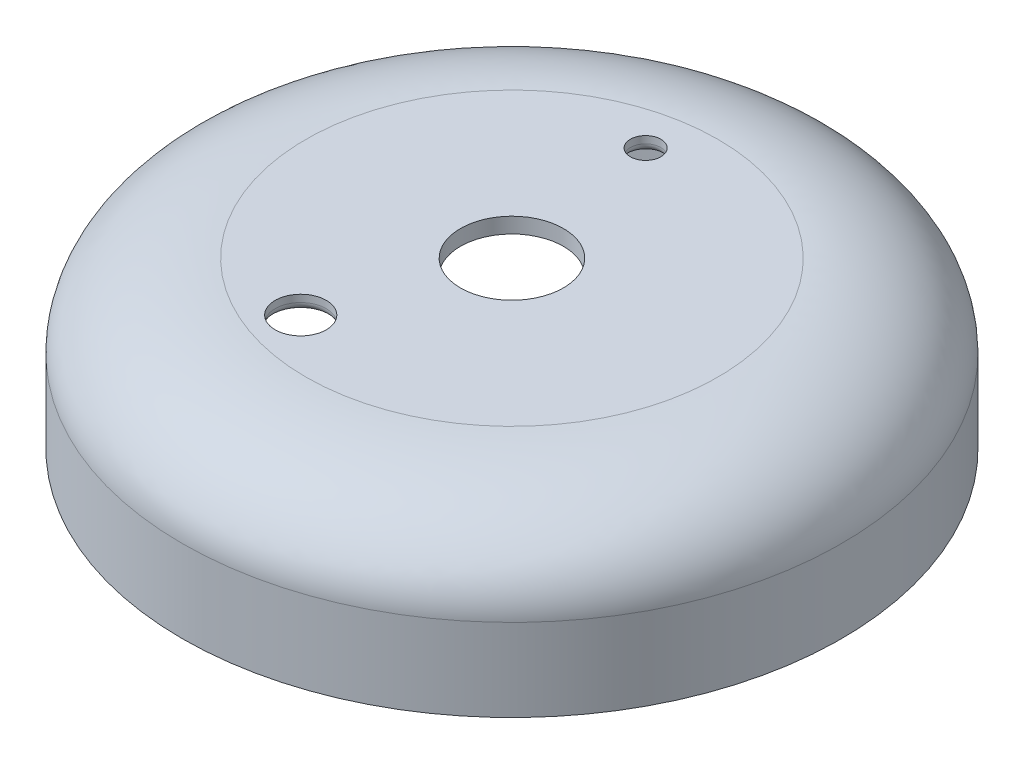
ISO-10303-21;
HEADER;
FILE_DESCRIPTION(('STEP AP214'),'2;1');
FILE_NAME('part.step','',(''),(''),'','','');
FILE_SCHEMA(('AUTOMOTIVE_DESIGN { 1 0 10303 214 1 1 1 1 }'));
ENDSEC;
DATA;
#1=APPLICATION_CONTEXT('core data for automotive mechanical design processes');
#2=APPLICATION_PROTOCOL_DEFINITION('international standard','automotive_design',2000,#1);
#3=PRODUCT_CONTEXT('',#1,'mechanical');
#4=PRODUCT('Part','Part','',(#3));
#5=PRODUCT_RELATED_PRODUCT_CATEGORY('part','',(#4));
#6=PRODUCT_DEFINITION_FORMATION('','',#4);
#7=PRODUCT_DEFINITION_CONTEXT('part definition',#1,'design');
#8=PRODUCT_DEFINITION('design','',#6,#7);
#9=PRODUCT_DEFINITION_SHAPE('','',#8);
#10=(LENGTH_UNIT() NAMED_UNIT(*) SI_UNIT(.MILLI.,.METRE.));
#11=(NAMED_UNIT(*) PLANE_ANGLE_UNIT() SI_UNIT($,.RADIAN.));
#12=(NAMED_UNIT(*) SI_UNIT($,.STERADIAN.) SOLID_ANGLE_UNIT());
#13=UNCERTAINTY_MEASURE_WITH_UNIT(LENGTH_MEASURE(1.E-05),#10,'distance_accuracy_value','');
#14=(GEOMETRIC_REPRESENTATION_CONTEXT(3) GLOBAL_UNCERTAINTY_ASSIGNED_CONTEXT((#13)) GLOBAL_UNIT_ASSIGNED_CONTEXT((#10,
#11,#12)) REPRESENTATION_CONTEXT('',''));
#15=CARTESIAN_POINT('',(0.,0.,0.));
#16=DIRECTION('',(0.,0.,1.));
#17=DIRECTION('',(1.,0.,0.));
#18=AXIS2_PLACEMENT_3D('',#15,#16,#17);
#19=CARTESIAN_POINT('',(0.,0.,0.));
#20=DIRECTION('',(0.,-1.,0.));
#21=DIRECTION('',(0.,0.,-1.));
#22=AXIS2_PLACEMENT_3D('',#19,#20,#21);
#23=PLANE('',#22);
#24=CARTESIAN_POINT('',(-17.3746232809435,0.,47.7363851359243));
#25=DIRECTION('',(0.,1.,0.));
#26=DIRECTION('',(0.,0.,1.));
#27=AXIS2_PLACEMENT_3D('',#24,#25,#26);
#28=CIRCLE('',#27,7.874);
#29=CARTESIAN_POINT('',(-17.3746232809435,0.,55.6103851359243));
#30=VERTEX_POINT('',#29);
#31=EDGE_CURVE('E58',#30,#30,#28,.T.);
#32=ORIENTED_EDGE('',*,*,#31,.F.);
#33=EDGE_LOOP('',(#32));
#34=FACE_BOUND('',#33,.T.);
#35=CARTESIAN_POINT('',(0.,0.,0.));
#36=DIRECTION('',(0.,1.,0.));
#37=DIRECTION('',(0.,0.,1.));
#38=AXIS2_PLACEMENT_3D('',#35,#36,#37);
#39=CIRCLE('',#38,15.875);
#40=CARTESIAN_POINT('',(0.,0.,15.875));
#41=VERTEX_POINT('',#40);
#42=EDGE_CURVE('E200',#41,#41,#39,.T.);
#43=ORIENTED_EDGE('',*,*,#42,.F.);
#44=EDGE_LOOP('',(#43));
#45=FACE_BOUND('',#44,.T.);
#46=CARTESIAN_POINT('',(-8.82132742548024,0.,-50.0282338530201));
#47=DIRECTION('',(0.,1.,0.));
#48=DIRECTION('',(0.,0.,1.));
#49=AXIS2_PLACEMENT_3D('',#46,#47,#48);
#50=CIRCLE('',#49,4.69899999999999);
#51=CARTESIAN_POINT('',(-8.82132742548024,0.,-45.3292338530201));
#52=VERTEX_POINT('',#51);
#53=EDGE_CURVE('E198',#52,#52,#50,.T.);
#54=ORIENTED_EDGE('',*,*,#53,.F.);
#55=EDGE_LOOP('',(#54));
#56=FACE_BOUND('',#55,.T.);
#57=CARTESIAN_POINT('',(0.,0.,0.));
#58=DIRECTION('',(0.,1.,0.));
#59=DIRECTION('',(0.,0.,1.));
#60=AXIS2_PLACEMENT_3D('',#57,#58,#59);
#61=CIRCLE('',#60,63.5);
#62=CARTESIAN_POINT('',(0.,0.,63.5));
#63=VERTEX_POINT('',#62);
#64=EDGE_CURVE('E53',#63,#63,#61,.T.);
#65=ORIENTED_EDGE('',*,*,#64,.T.);
#66=EDGE_LOOP('',(#65));
#67=FACE_BOUND('',#66,.T.);
#68=ADVANCED_FACE('F33',(#34,#45,#56,#67),#23,.F.);
#69=CARTESIAN_POINT('',(63.5,-25.4,0.));
#70=DIRECTION('',(0.,0.,1.));
#71=DIRECTION('',(-1.,0.,0.));
#72=AXIS2_PLACEMENT_3D('',#69,#70,#71);
#73=ELLIPSE('',#72,38.1,25.4);
#74=CARTESIAN_POINT('',(0.,29.511089747257,0.));
#75=DIRECTION('',(0.,1.,0.));
#76=AXIS1_PLACEMENT('',#74,#75);
#77=SURFACE_OF_REVOLUTION('',#73,#76);
#78=ORIENTED_EDGE('',*,*,#64,.F.);
#79=EDGE_LOOP('',(#78));
#80=FACE_BOUND('',#79,.T.);
#81=CARTESIAN_POINT('',(0.,-25.4,0.));
#82=DIRECTION('',(0.,1.,0.));
#83=DIRECTION('',(0.,0.,1.));
#84=AXIS2_PLACEMENT_3D('',#81,#82,#83);
#85=CIRCLE('',#84,101.6);
#86=CARTESIAN_POINT('',(0.,-25.4,101.6));
#87=VERTEX_POINT('',#86);
#88=EDGE_CURVE('E61',#87,#87,#85,.T.);
#89=ORIENTED_EDGE('',*,*,#88,.T.);
#90=EDGE_LOOP('',(#89));
#91=FACE_BOUND('',#90,.T.);
#92=ADVANCED_FACE('F80',(#80,#91),#77,.T.);
#93=CARTESIAN_POINT('',(0.,29.511089747257,0.));
#94=DIRECTION('',(0.,1.,0.));
#95=DIRECTION('',(0.,0.,1.));
#96=AXIS2_PLACEMENT_3D('',#93,#94,#95);
#97=CYLINDRICAL_SURFACE('',#96,101.6);
#98=ORIENTED_EDGE('',*,*,#88,.F.);
#99=EDGE_LOOP('',(#98));
#100=FACE_BOUND('',#99,.T.);
#101=CARTESIAN_POINT('',(0.,-50.8,0.));
#102=DIRECTION('',(0.,1.,0.));
#103=DIRECTION('',(0.,0.,1.));
#104=AXIS2_PLACEMENT_3D('',#101,#102,#103);
#105=CIRCLE('',#104,101.6);
#106=CARTESIAN_POINT('',(0.,-50.8,101.6));
#107=VERTEX_POINT('',#106);
#108=EDGE_CURVE('E64',#107,#107,#105,.T.);
#109=ORIENTED_EDGE('',*,*,#108,.T.);
#110=EDGE_LOOP('',(#109));
#111=FACE_BOUND('',#110,.T.);
#112=ADVANCED_FACE('F84',(#100,#111),#97,.T.);
#113=CARTESIAN_POINT('',(96.8375,-50.8,0.));
#114=DIRECTION('',(0.,1.,0.));
#115=DIRECTION('',(0.,0.,1.));
#116=AXIS2_PLACEMENT_3D('',#113,#114,#115);
#117=PLANE('',#116);
#118=ORIENTED_EDGE('',*,*,#108,.F.);
#119=EDGE_LOOP('',(#118));
#120=FACE_BOUND('',#119,.T.);
#121=CARTESIAN_POINT('',(0.,-50.8,0.));
#122=DIRECTION('',(0.,1.,0.));
#123=DIRECTION('',(0.,0.,1.));
#124=AXIS2_PLACEMENT_3D('',#121,#122,#123);
#125=CIRCLE('',#124,96.8375);
#126=CARTESIAN_POINT('',(0.,-50.8,96.8375));
#127=VERTEX_POINT('',#126);
#128=EDGE_CURVE('E67',#127,#127,#125,.T.);
#129=ORIENTED_EDGE('',*,*,#128,.T.);
#130=EDGE_LOOP('',(#129));
#131=FACE_BOUND('',#130,.T.);
#132=ADVANCED_FACE('F122',(#120,#131),#117,.F.);
#133=CARTESIAN_POINT('',(0.,29.511089747257,0.));
#134=DIRECTION('',(0.,1.,0.));
#135=DIRECTION('',(0.,0.,1.));
#136=AXIS2_PLACEMENT_3D('',#133,#134,#135);
#137=CYLINDRICAL_SURFACE('',#136,96.8375);
#138=ORIENTED_EDGE('',*,*,#128,.F.);
#139=EDGE_LOOP('',(#138));
#140=FACE_BOUND('',#139,.T.);
#141=CARTESIAN_POINT('',(0.,-25.4,0.));
#142=DIRECTION('',(0.,1.,0.));
#143=DIRECTION('',(0.,0.,1.));
#144=AXIS2_PLACEMENT_3D('',#141,#142,#143);
#145=CIRCLE('',#144,96.8375);
#146=CARTESIAN_POINT('',(0.,-25.4,96.8375));
#147=VERTEX_POINT('',#146);
#148=EDGE_CURVE('E70',#147,#147,#145,.T.);
#149=ORIENTED_EDGE('',*,*,#148,.T.);
#150=EDGE_LOOP('',(#149));
#151=FACE_BOUND('',#150,.T.);
#152=ADVANCED_FACE('F116',(#140,#151),#137,.F.);
#153=CARTESIAN_POINT('',(63.5,-25.4,0.));
#154=DIRECTION('',(0.,0.,-1.));
#155=DIRECTION('',(1.,0.,0.));
#156=AXIS2_PLACEMENT_3D('',#153,#154,#155);
#157=ELLIPSE('',#156,33.3375,20.6375);
#158=CARTESIAN_POINT('',(0.,29.511089747257,0.));
#159=DIRECTION('',(0.,1.,0.));
#160=AXIS1_PLACEMENT('',#158,#159);
#161=SURFACE_OF_REVOLUTION('',#157,#160);
#162=ORIENTED_EDGE('',*,*,#148,.F.);
#163=EDGE_LOOP('',(#162));
#164=FACE_BOUND('',#163,.T.);
#165=CARTESIAN_POINT('',(0.,-4.7625,0.));
#166=DIRECTION('',(0.,1.,0.));
#167=DIRECTION('',(0.,0.,1.));
#168=AXIS2_PLACEMENT_3D('',#165,#166,#167);
#169=CIRCLE('',#168,63.5);
#170=CARTESIAN_POINT('',(0.,-4.7625,63.5));
#171=VERTEX_POINT('',#170);
#172=EDGE_CURVE('E57',#171,#171,#169,.T.);
#173=ORIENTED_EDGE('',*,*,#172,.T.);
#174=EDGE_LOOP('',(#173));
#175=FACE_BOUND('',#174,.T.);
#176=ADVANCED_FACE('F107',(#164,#175),#161,.T.);
#177=CARTESIAN_POINT('',(0.,-4.7625,0.));
#178=DIRECTION('',(0.,1.,0.));
#179=DIRECTION('',(0.,0.,1.));
#180=AXIS2_PLACEMENT_3D('',#177,#178,#179);
#181=PLANE('',#180);
#182=CARTESIAN_POINT('',(-8.82132742548024,-4.7625,-50.0282338530201));
#183=DIRECTION('',(0.,1.,0.));
#184=DIRECTION('',(0.,0.,1.));
#185=AXIS2_PLACEMENT_3D('',#182,#183,#184);
#186=CIRCLE('',#185,7.23899999999999);
#187=CARTESIAN_POINT('',(-8.82132742548024,-4.7625,-42.7892338530201));
#188=VERTEX_POINT('',#187);
#189=EDGE_CURVE('E44',#188,#188,#186,.T.);
#190=ORIENTED_EDGE('',*,*,#189,.T.);
#191=EDGE_LOOP('',(#190));
#192=FACE_BOUND('',#191,.T.);
#193=CARTESIAN_POINT('',(-17.3746232809435,-4.7625,47.7363851359243));
#194=DIRECTION('',(0.,1.,0.));
#195=DIRECTION('',(0.,0.,1.));
#196=AXIS2_PLACEMENT_3D('',#193,#194,#195);
#197=CIRCLE('',#196,10.414);
#198=CARTESIAN_POINT('',(-17.3746232809435,-4.7625,58.1503851359243));
#199=VERTEX_POINT('',#198);
#200=EDGE_CURVE('E48',#199,#199,#197,.T.);
#201=ORIENTED_EDGE('',*,*,#200,.T.);
#202=EDGE_LOOP('',(#201));
#203=FACE_BOUND('',#202,.T.);
#204=CARTESIAN_POINT('',(0.,-4.7625,0.));
#205=DIRECTION('',(0.,1.,0.));
#206=DIRECTION('',(0.,0.,1.));
#207=AXIS2_PLACEMENT_3D('',#204,#205,#206);
#208=CIRCLE('',#207,15.875);
#209=CARTESIAN_POINT('',(0.,-4.7625,15.875));
#210=VERTEX_POINT('',#209);
#211=EDGE_CURVE('E54',#210,#210,#208,.T.);
#212=ORIENTED_EDGE('',*,*,#211,.T.);
#213=EDGE_LOOP('',(#212));
#214=FACE_BOUND('',#213,.T.);
#215=ORIENTED_EDGE('',*,*,#172,.F.);
#216=EDGE_LOOP('',(#215));
#217=FACE_BOUND('',#216,.T.);
#218=ADVANCED_FACE('F103',(#192,#203,#214,#217),#181,.F.);
#219=CARTESIAN_POINT('',(-8.82132742548024,-25.4,-50.0282338530201));
#220=DIRECTION('',(0.,1.,0.));
#221=DIRECTION('',(0.,0.,1.));
#222=AXIS2_PLACEMENT_3D('',#219,#220,#221);
#223=CYLINDRICAL_SURFACE('',#222,4.69899999999999);
#224=CARTESIAN_POINT('',(-8.82132742548024,-2.2225,-50.0282338530201));
#225=DIRECTION('',(0.,1.,0.));
#226=DIRECTION('',(0.,0.,1.));
#227=AXIS2_PLACEMENT_3D('',#224,#225,#226);
#228=CIRCLE('',#227,4.69899999999999);
#229=CARTESIAN_POINT('',(-8.82132742548024,-2.2225,-45.3292338530201));
#230=VERTEX_POINT('',#229);
#231=EDGE_CURVE('E40',#230,#230,#228,.F.);
#232=ORIENTED_EDGE('',*,*,#231,.T.);
#233=EDGE_LOOP('',(#232));
#234=FACE_BOUND('',#233,.T.);
#235=ORIENTED_EDGE('',*,*,#53,.T.);
#236=EDGE_LOOP('',(#235));
#237=FACE_BOUND('',#236,.T.);
#238=ADVANCED_FACE('F106',(#234,#237),#223,.F.);
#239=CARTESIAN_POINT('',(0.,-25.4,0.));
#240=DIRECTION('',(0.,1.,0.));
#241=DIRECTION('',(0.,0.,1.));
#242=AXIS2_PLACEMENT_3D('',#239,#240,#241);
#243=CYLINDRICAL_SURFACE('',#242,15.875);
#244=ORIENTED_EDGE('',*,*,#42,.T.);
#245=EDGE_LOOP('',(#244));
#246=FACE_BOUND('',#245,.T.);
#247=ORIENTED_EDGE('',*,*,#211,.F.);
#248=EDGE_LOOP('',(#247));
#249=FACE_BOUND('',#248,.T.);
#250=ADVANCED_FACE('F98',(#246,#249),#243,.F.);
#251=CARTESIAN_POINT('',(-17.3746232809435,-25.4,47.7363851359243));
#252=DIRECTION('',(0.,1.,0.));
#253=DIRECTION('',(0.,0.,1.));
#254=AXIS2_PLACEMENT_3D('',#251,#252,#253);
#255=CYLINDRICAL_SURFACE('',#254,7.874);
#256=CARTESIAN_POINT('',(-17.3746232809435,-2.2225,47.7363851359243));
#257=DIRECTION('',(0.,1.,0.));
#258=DIRECTION('',(0.,0.,1.));
#259=AXIS2_PLACEMENT_3D('',#256,#257,#258);
#260=CIRCLE('',#259,7.874);
#261=CARTESIAN_POINT('',(-17.3746232809435,-2.2225,55.6103851359243));
#262=VERTEX_POINT('',#261);
#263=EDGE_CURVE('E10',#262,#262,#260,.F.);
#264=ORIENTED_EDGE('',*,*,#263,.T.);
#265=EDGE_LOOP('',(#264));
#266=FACE_BOUND('',#265,.T.);
#267=ORIENTED_EDGE('',*,*,#31,.T.);
#268=EDGE_LOOP('',(#267));
#269=FACE_BOUND('',#268,.T.);
#270=ADVANCED_FACE('F91',(#266,#269),#255,.F.);
#271=CARTESIAN_POINT('',(-8.82132742548024,-2.2225,-50.0282338530201));
#272=DIRECTION('',(0.,1.,0.));
#273=DIRECTION('',(0.,0.,1.));
#274=AXIS2_PLACEMENT_3D('',#271,#272,#273);
#275=TOROIDAL_SURFACE('',#274,7.23899999999999,2.54);
#276=ORIENTED_EDGE('',*,*,#231,.F.);
#277=EDGE_LOOP('',(#276));
#278=FACE_BOUND('',#277,.T.);
#279=ORIENTED_EDGE('',*,*,#189,.F.);
#280=EDGE_LOOP('',(#279));
#281=FACE_BOUND('',#280,.T.);
#282=ADVANCED_FACE('F89',(#278,#281),#275,.T.);
#283=CARTESIAN_POINT('',(-17.3746232809435,-2.2225,47.7363851359243));
#284=DIRECTION('',(0.,1.,0.));
#285=DIRECTION('',(0.,0.,1.));
#286=AXIS2_PLACEMENT_3D('',#283,#284,#285);
#287=TOROIDAL_SURFACE('',#286,10.414,2.54);
#288=ORIENTED_EDGE('',*,*,#263,.F.);
#289=EDGE_LOOP('',(#288));
#290=FACE_BOUND('',#289,.T.);
#291=ORIENTED_EDGE('',*,*,#200,.F.);
#292=EDGE_LOOP('',(#291));
#293=FACE_BOUND('',#292,.T.);
#294=ADVANCED_FACE('F35',(#290,#293),#287,.T.);
#295=CLOSED_SHELL('',(#68,#92,#112,#132,#152,#176,#218,#238,#250,#270,#282,#294));
#296=MANIFOLD_SOLID_BREP('B2',#295);
#297=ADVANCED_BREP_SHAPE_REPRESENTATION('',(#18,#296),#14);
#298=SHAPE_DEFINITION_REPRESENTATION(#9,#297);
ENDSEC;
END-ISO-10303-21;
